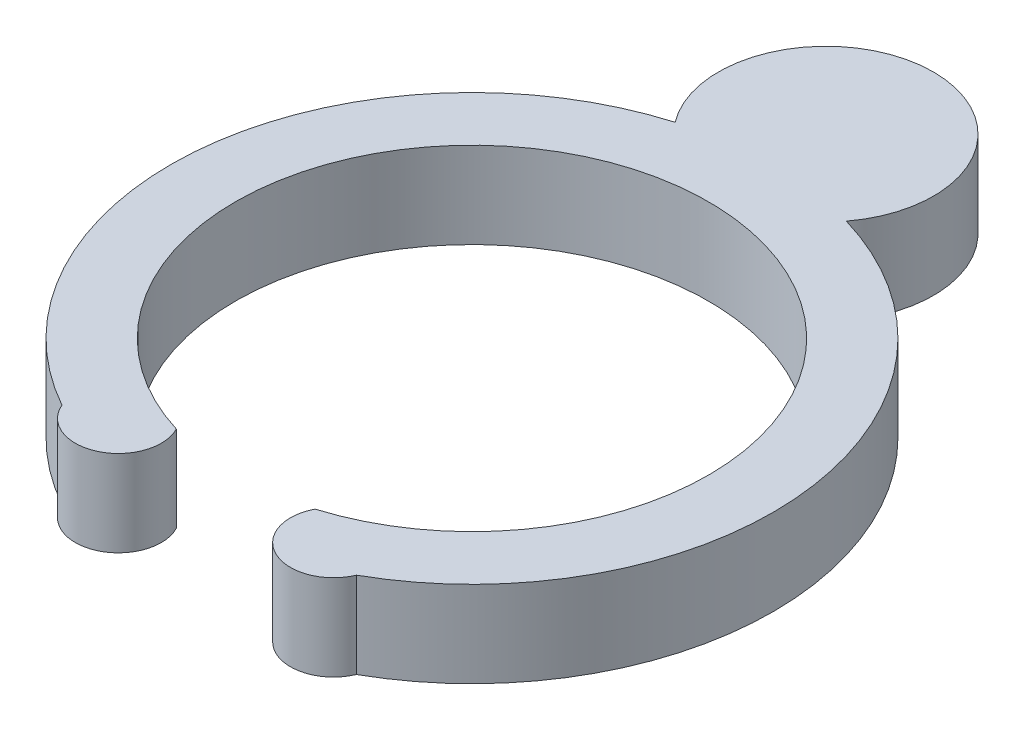
ISO-10303-21;
HEADER;
FILE_DESCRIPTION(('STEP AP214'),'2;1');
FILE_NAME('part.step','',(''),(''),'','','');
FILE_SCHEMA(('AUTOMOTIVE_DESIGN { 1 0 10303 214 1 1 1 1 }'));
ENDSEC;
DATA;
#1=APPLICATION_CONTEXT('core data for automotive mechanical design processes');
#2=APPLICATION_PROTOCOL_DEFINITION('international standard','automotive_design',2000,#1);
#3=PRODUCT_CONTEXT('',#1,'mechanical');
#4=PRODUCT('Part','Part','',(#3));
#5=PRODUCT_RELATED_PRODUCT_CATEGORY('part','',(#4));
#6=PRODUCT_DEFINITION_FORMATION('','',#4);
#7=PRODUCT_DEFINITION_CONTEXT('part definition',#1,'design');
#8=PRODUCT_DEFINITION('design','',#6,#7);
#9=PRODUCT_DEFINITION_SHAPE('','',#8);
#10=(LENGTH_UNIT() NAMED_UNIT(*) SI_UNIT(.MILLI.,.METRE.));
#11=(NAMED_UNIT(*) PLANE_ANGLE_UNIT() SI_UNIT($,.RADIAN.));
#12=(NAMED_UNIT(*) SI_UNIT($,.STERADIAN.) SOLID_ANGLE_UNIT());
#13=UNCERTAINTY_MEASURE_WITH_UNIT(LENGTH_MEASURE(1.E-05),#10,'distance_accuracy_value','');
#14=(GEOMETRIC_REPRESENTATION_CONTEXT(3) GLOBAL_UNCERTAINTY_ASSIGNED_CONTEXT((#13)) GLOBAL_UNIT_ASSIGNED_CONTEXT((#10,
#11,#12)) REPRESENTATION_CONTEXT('',''));
#15=CARTESIAN_POINT('',(0.,0.,0.));
#16=DIRECTION('',(0.,0.,1.));
#17=DIRECTION('',(1.,0.,0.));
#18=AXIS2_PLACEMENT_3D('',#15,#16,#17);
#19=CARTESIAN_POINT('',(0.,2.,0.));
#20=DIRECTION('',(0.,-1.,0.));
#21=DIRECTION('',(0.,0.,-1.));
#22=AXIS2_PLACEMENT_3D('',#19,#20,#21);
#23=CYLINDRICAL_SURFACE('',#22,7.);
#24=CARTESIAN_POINT('',(0.,2.,0.));
#25=DIRECTION('',(0.,1.,0.));
#26=DIRECTION('',(0.,0.,1.));
#27=AXIS2_PLACEMENT_3D('',#24,#25,#26);
#28=CIRCLE('',#27,7.);
#29=CARTESIAN_POINT('',(3.42161865317822,2.,6.10676066275918));
#30=VERTEX_POINT('',#29);
#31=CARTESIAN_POINT('',(1.98903890696883,2.,-6.71146215265826));
#32=VERTEX_POINT('',#31);
#33=EDGE_CURVE('E127',#30,#32,#28,.T.);
#34=ORIENTED_EDGE('',*,*,#33,.F.);
#35=DIRECTION('',(0.,1.,0.));
#36=VECTOR('',#35,1.);
#37=CARTESIAN_POINT('',(3.42161865317821,1.,6.10676066275918));
#38=LINE('',#37,#36);
#39=CARTESIAN_POINT('',(3.42161865317822,0.,6.10676066275918));
#40=VERTEX_POINT('',#39);
#41=EDGE_CURVE('E106',#30,#40,#38,.F.);
#42=ORIENTED_EDGE('',*,*,#41,.T.);
#43=CARTESIAN_POINT('',(0.,0.,0.));
#44=DIRECTION('',(0.,1.,0.));
#45=DIRECTION('',(0.,0.,1.));
#46=AXIS2_PLACEMENT_3D('',#43,#44,#45);
#47=CIRCLE('',#46,7.);
#48=CARTESIAN_POINT('',(1.98903890696883,0.,-6.71146215265826));
#49=VERTEX_POINT('',#48);
#50=EDGE_CURVE('E125',#40,#49,#47,.T.);
#51=ORIENTED_EDGE('',*,*,#50,.T.);
#52=DIRECTION('',(0.,-1.,0.));
#53=VECTOR('',#52,1.);
#54=CARTESIAN_POINT('',(1.98903890696883,1.,-6.71146215265826));
#55=LINE('',#54,#53);
#56=EDGE_CURVE('E95',#49,#32,#55,.F.);
#57=ORIENTED_EDGE('',*,*,#56,.T.);
#58=EDGE_LOOP('',(#34,#42,#51,#57));
#59=FACE_BOUND('',#58,.T.);
#60=ADVANCED_FACE('F36',(#59),#23,.T.);
#61=CARTESIAN_POINT('',(-1.98903890696883,0.,-6.71146215265826));
#62=VERTEX_POINT('',#61);
#63=CARTESIAN_POINT('',(-3.42161865317822,0.,6.10676066275918));
#64=VERTEX_POINT('',#63);
#65=EDGE_CURVE('E128',#62,#64,#47,.T.);
#66=ORIENTED_EDGE('',*,*,#65,.T.);
#67=DIRECTION('',(0.,1.,0.));
#68=VECTOR('',#67,1.);
#69=CARTESIAN_POINT('',(-3.42161865317821,1.,6.10676066275918));
#70=LINE('',#69,#68);
#71=CARTESIAN_POINT('',(-3.42161865317822,2.,6.10676066275918));
#72=VERTEX_POINT('',#71);
#73=EDGE_CURVE('E58',#64,#72,#70,.T.);
#74=ORIENTED_EDGE('',*,*,#73,.T.);
#75=CARTESIAN_POINT('',(-1.98903890696883,2.,-6.71146215265826));
#76=VERTEX_POINT('',#75);
#77=EDGE_CURVE('E44',#76,#72,#28,.T.);
#78=ORIENTED_EDGE('',*,*,#77,.F.);
#79=DIRECTION('',(0.,-1.,0.));
#80=VECTOR('',#79,1.);
#81=CARTESIAN_POINT('',(-1.98903890696883,1.,-6.71146215265826));
#82=LINE('',#81,#80);
#83=EDGE_CURVE('E118',#76,#62,#82,.T.);
#84=ORIENTED_EDGE('',*,*,#83,.T.);
#85=EDGE_LOOP('',(#66,#74,#78,#84));
#86=FACE_BOUND('',#85,.T.);
#87=ADVANCED_FACE('F38',(#86),#23,.T.);
#88=CARTESIAN_POINT('',(0.,2.,0.));
#89=DIRECTION('',(0.,1.,0.));
#90=DIRECTION('',(0.,0.,1.));
#91=AXIS2_PLACEMENT_3D('',#88,#89,#90);
#92=PLANE('',#91);
#93=CARTESIAN_POINT('',(0.,2.,0.));
#94=DIRECTION('',(0.,1.,0.));
#95=DIRECTION('',(0.,0.,1.));
#96=AXIS2_PLACEMENT_3D('',#93,#94,#95);
#97=CIRCLE('',#96,5.5);
#98=CARTESIAN_POINT('',(1.61221887728095,2.,5.25839807277264));
#99=VERTEX_POINT('',#98);
#100=CARTESIAN_POINT('',(-1.61221887728095,2.,5.25839807277263));
#101=VERTEX_POINT('',#100);
#102=EDGE_CURVE('E50',#99,#101,#97,.T.);
#103=ORIENTED_EDGE('',*,*,#102,.F.);
#104=CARTESIAN_POINT('',(2.5,2.,5.71866395043868));
#105=DIRECTION('',(0.,1.,0.));
#106=DIRECTION('',(0.,0.,1.));
#107=AXIS2_PLACEMENT_3D('',#104,#105,#106);
#108=CIRCLE('',#107,1.);
#109=EDGE_CURVE('E90',#99,#30,#108,.T.);
#110=ORIENTED_EDGE('',*,*,#109,.T.);
#111=ORIENTED_EDGE('',*,*,#33,.T.);
#112=CARTESIAN_POINT('',(0.,2.,-8.22596676690155));
#113=DIRECTION('',(0.,-1.,0.));
#114=DIRECTION('',(0.,0.,-1.));
#115=AXIS2_PLACEMENT_3D('',#112,#113,#114);
#116=CIRCLE('',#115,2.5);
#117=EDGE_CURVE('E115',#76,#32,#116,.T.);
#118=ORIENTED_EDGE('',*,*,#117,.F.);
#119=ORIENTED_EDGE('',*,*,#77,.T.);
#120=CARTESIAN_POINT('',(-2.5,2.,5.71866395043868));
#121=DIRECTION('',(0.,1.,0.));
#122=DIRECTION('',(0.,0.,1.));
#123=AXIS2_PLACEMENT_3D('',#120,#121,#122);
#124=CIRCLE('',#123,1.);
#125=EDGE_CURVE('E93',#72,#101,#124,.T.);
#126=ORIENTED_EDGE('',*,*,#125,.T.);
#127=EDGE_LOOP('',(#103,#110,#111,#118,#119,#126));
#128=FACE_BOUND('',#127,.T.);
#129=ADVANCED_FACE('F88',(#128),#92,.T.);
#130=CARTESIAN_POINT('',(0.,0.,0.));
#131=DIRECTION('',(0.,1.,0.));
#132=DIRECTION('',(0.,0.,1.));
#133=AXIS2_PLACEMENT_3D('',#130,#131,#132);
#134=PLANE('',#133);
#135=CARTESIAN_POINT('',(2.5,0.,5.71866395043868));
#136=DIRECTION('',(0.,1.,0.));
#137=DIRECTION('',(0.,0.,1.));
#138=AXIS2_PLACEMENT_3D('',#135,#136,#137);
#139=CIRCLE('',#138,1.);
#140=CARTESIAN_POINT('',(1.61221887728095,0.,5.25839807277264));
#141=VERTEX_POINT('',#140);
#142=EDGE_CURVE('E107',#141,#40,#139,.T.);
#143=ORIENTED_EDGE('',*,*,#142,.F.);
#144=CARTESIAN_POINT('',(0.,0.,0.));
#145=DIRECTION('',(0.,1.,0.));
#146=DIRECTION('',(0.,0.,1.));
#147=AXIS2_PLACEMENT_3D('',#144,#145,#146);
#148=CIRCLE('',#147,5.5);
#149=CARTESIAN_POINT('',(-1.61221887728095,0.,5.25839807277263));
#150=VERTEX_POINT('',#149);
#151=EDGE_CURVE('E94',#141,#150,#148,.T.);
#152=ORIENTED_EDGE('',*,*,#151,.T.);
#153=CARTESIAN_POINT('',(-2.5,0.,5.71866395043868));
#154=DIRECTION('',(0.,1.,0.));
#155=DIRECTION('',(0.,0.,1.));
#156=AXIS2_PLACEMENT_3D('',#153,#154,#155);
#157=CIRCLE('',#156,1.);
#158=EDGE_CURVE('E110',#64,#150,#157,.T.);
#159=ORIENTED_EDGE('',*,*,#158,.F.);
#160=ORIENTED_EDGE('',*,*,#65,.F.);
#161=CARTESIAN_POINT('',(0.,0.,-8.22596676690155));
#162=DIRECTION('',(0.,-1.,0.));
#163=DIRECTION('',(0.,0.,-1.));
#164=AXIS2_PLACEMENT_3D('',#161,#162,#163);
#165=CIRCLE('',#164,2.5);
#166=EDGE_CURVE('E114',#62,#49,#165,.T.);
#167=ORIENTED_EDGE('',*,*,#166,.T.);
#168=ORIENTED_EDGE('',*,*,#50,.F.);
#169=EDGE_LOOP('',(#143,#152,#159,#160,#167,#168));
#170=FACE_BOUND('',#169,.T.);
#171=ADVANCED_FACE('F138',(#170),#134,.F.);
#172=CARTESIAN_POINT('',(0.,0.,0.));
#173=DIRECTION('',(0.,1.,0.));
#174=DIRECTION('',(0.,0.,1.));
#175=AXIS2_PLACEMENT_3D('',#172,#173,#174);
#176=CYLINDRICAL_SURFACE('',#175,5.5);
#177=ORIENTED_EDGE('',*,*,#102,.T.);
#178=DIRECTION('',(0.,1.,0.));
#179=VECTOR('',#178,1.);
#180=CARTESIAN_POINT('',(-1.61221887728095,1.,5.25839807277263));
#181=LINE('',#180,#179);
#182=EDGE_CURVE('E11',#101,#150,#181,.F.);
#183=ORIENTED_EDGE('',*,*,#182,.T.);
#184=ORIENTED_EDGE('',*,*,#151,.F.);
#185=DIRECTION('',(0.,1.,0.));
#186=VECTOR('',#185,1.);
#187=CARTESIAN_POINT('',(1.61221887728095,1.,5.25839807277264));
#188=LINE('',#187,#186);
#189=EDGE_CURVE('E98',#141,#99,#188,.T.);
#190=ORIENTED_EDGE('',*,*,#189,.T.);
#191=EDGE_LOOP('',(#177,#183,#184,#190));
#192=FACE_BOUND('',#191,.T.);
#193=ADVANCED_FACE('F99',(#192),#176,.F.);
#194=CARTESIAN_POINT('',(0.,2.,-8.22596676690155));
#195=DIRECTION('',(0.,-1.,0.));
#196=DIRECTION('',(0.,0.,-1.));
#197=AXIS2_PLACEMENT_3D('',#194,#195,#196);
#198=CYLINDRICAL_SURFACE('',#197,2.5);
#199=ORIENTED_EDGE('',*,*,#56,.F.);
#200=ORIENTED_EDGE('',*,*,#166,.F.);
#201=ORIENTED_EDGE('',*,*,#83,.F.);
#202=ORIENTED_EDGE('',*,*,#117,.T.);
#203=EDGE_LOOP('',(#199,#200,#201,#202));
#204=FACE_BOUND('',#203,.T.);
#205=ADVANCED_FACE('F135',(#204),#198,.T.);
#206=CARTESIAN_POINT('',(2.5,0.,5.71866395043868));
#207=DIRECTION('',(0.,1.,0.));
#208=DIRECTION('',(0.,0.,1.));
#209=AXIS2_PLACEMENT_3D('',#206,#207,#208);
#210=CYLINDRICAL_SURFACE('',#209,1.);
#211=ORIENTED_EDGE('',*,*,#189,.F.);
#212=ORIENTED_EDGE('',*,*,#142,.T.);
#213=ORIENTED_EDGE('',*,*,#41,.F.);
#214=ORIENTED_EDGE('',*,*,#109,.F.);
#215=EDGE_LOOP('',(#211,#212,#213,#214));
#216=FACE_BOUND('',#215,.T.);
#217=ADVANCED_FACE('F104',(#216),#210,.T.);
#218=CARTESIAN_POINT('',(-2.5,0.,5.71866395043868));
#219=DIRECTION('',(0.,1.,0.));
#220=DIRECTION('',(0.,0.,1.));
#221=AXIS2_PLACEMENT_3D('',#218,#219,#220);
#222=CYLINDRICAL_SURFACE('',#221,1.);
#223=ORIENTED_EDGE('',*,*,#182,.F.);
#224=ORIENTED_EDGE('',*,*,#125,.F.);
#225=ORIENTED_EDGE('',*,*,#73,.F.);
#226=ORIENTED_EDGE('',*,*,#158,.T.);
#227=EDGE_LOOP('',(#223,#224,#225,#226));
#228=FACE_BOUND('',#227,.T.);
#229=ADVANCED_FACE('F142',(#228),#222,.T.);
#230=CLOSED_SHELL('',(#60,#87,#129,#171,#193,#205,#217,#229));
#231=MANIFOLD_SOLID_BREP('B2',#230);
#232=ADVANCED_BREP_SHAPE_REPRESENTATION('',(#18,#231),#14);
#233=SHAPE_DEFINITION_REPRESENTATION(#9,#232);
ENDSEC;
END-ISO-10303-21;
